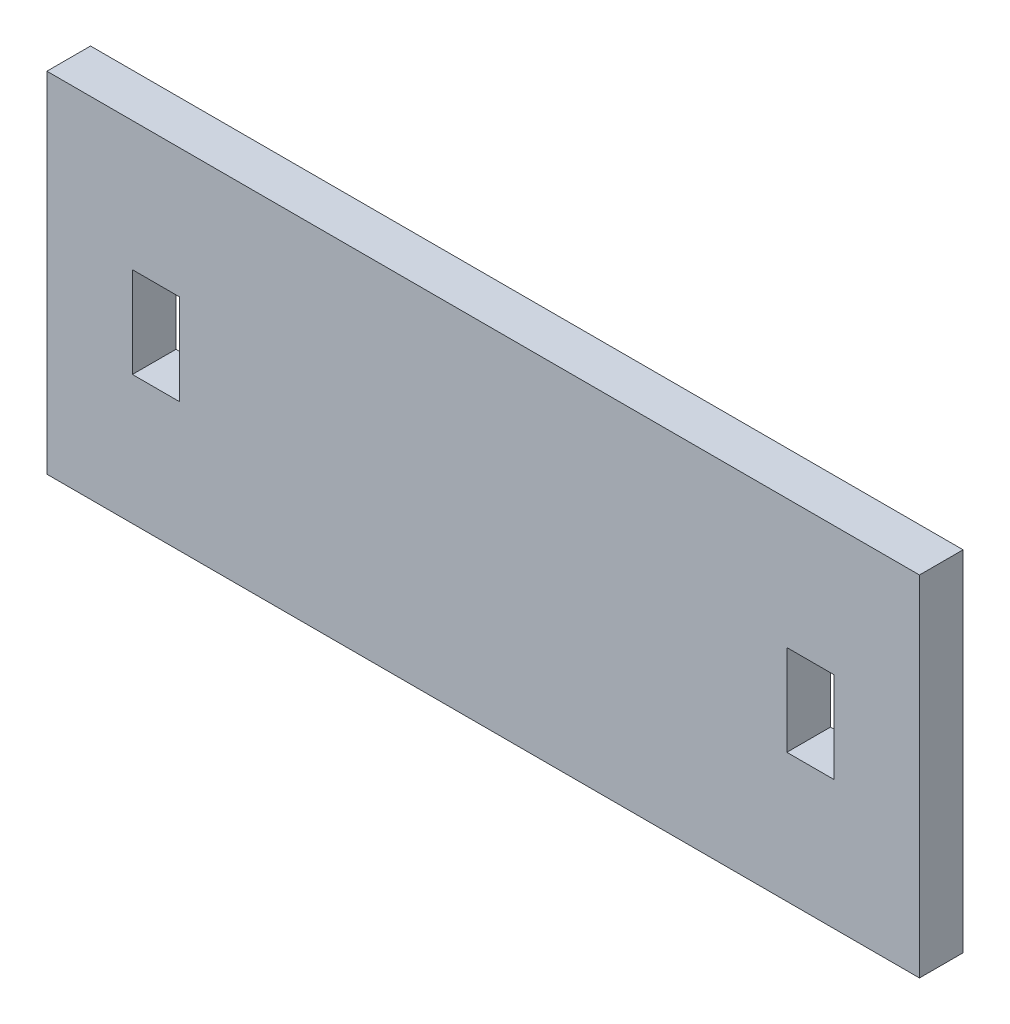
ISO-10303-21;
HEADER;
FILE_DESCRIPTION(('STEP AP214'),'2;1');
FILE_NAME('part.step','',(''),(''),'','','');
FILE_SCHEMA(('AUTOMOTIVE_DESIGN { 1 0 10303 214 1 1 1 1 }'));
ENDSEC;
DATA;
#1=APPLICATION_CONTEXT('core data for automotive mechanical design processes');
#2=APPLICATION_PROTOCOL_DEFINITION('international standard','automotive_design',2000,#1);
#3=PRODUCT_CONTEXT('',#1,'mechanical');
#4=PRODUCT('Part','Part','',(#3));
#5=PRODUCT_RELATED_PRODUCT_CATEGORY('part','',(#4));
#6=PRODUCT_DEFINITION_FORMATION('','',#4);
#7=PRODUCT_DEFINITION_CONTEXT('part definition',#1,'design');
#8=PRODUCT_DEFINITION('design','',#6,#7);
#9=PRODUCT_DEFINITION_SHAPE('','',#8);
#10=(LENGTH_UNIT() NAMED_UNIT(*) SI_UNIT(.MILLI.,.METRE.));
#11=(NAMED_UNIT(*) PLANE_ANGLE_UNIT() SI_UNIT($,.RADIAN.));
#12=(NAMED_UNIT(*) SI_UNIT($,.STERADIAN.) SOLID_ANGLE_UNIT());
#13=UNCERTAINTY_MEASURE_WITH_UNIT(LENGTH_MEASURE(1.E-05),#10,'distance_accuracy_value','');
#14=(GEOMETRIC_REPRESENTATION_CONTEXT(3) GLOBAL_UNCERTAINTY_ASSIGNED_CONTEXT((#13)) GLOBAL_UNIT_ASSIGNED_CONTEXT((#10,
#11,#12)) REPRESENTATION_CONTEXT('',''));
#15=CARTESIAN_POINT('',(0.,0.,0.));
#16=DIRECTION('',(0.,0.,1.));
#17=DIRECTION('',(1.,0.,0.));
#18=AXIS2_PLACEMENT_3D('',#15,#16,#17);
#19=CARTESIAN_POINT('',(-298.,114.,933.));
#20=DIRECTION('',(0.,0.,-1.));
#21=DIRECTION('',(-1.,0.,0.));
#22=AXIS2_PLACEMENT_3D('',#19,#20,#21);
#23=PLANE('',#22);
#24=DIRECTION('',(1.,0.,0.));
#25=VECTOR('',#24,1.);
#26=CARTESIAN_POINT('',(-223.,114.,933.));
#27=LINE('',#26,#25);
#28=CARTESIAN_POINT('',(-308.,114.,933.));
#29=VERTEX_POINT('',#28);
#30=CARTESIAN_POINT('',(-208.,114.,933.));
#31=VERTEX_POINT('',#30);
#32=EDGE_CURVE('E11',#29,#31,#27,.T.);
#33=ORIENTED_EDGE('',*,*,#32,.T.);
#34=DIRECTION('',(0.,1.,0.));
#35=VECTOR('',#34,1.);
#36=CARTESIAN_POINT('',(-208.,74.,933.));
#37=LINE('',#36,#35);
#38=CARTESIAN_POINT('',(-208.,74.,933.));
#39=VERTEX_POINT('',#38);
#40=EDGE_CURVE('E185',#39,#31,#37,.T.);
#41=ORIENTED_EDGE('',*,*,#40,.F.);
#42=DIRECTION('',(1.,0.,0.));
#43=VECTOR('',#42,1.);
#44=CARTESIAN_POINT('',(-223.,74.,933.));
#45=LINE('',#44,#43);
#46=CARTESIAN_POINT('',(-308.,74.,933.));
#47=VERTEX_POINT('',#46);
#48=EDGE_CURVE('E46',#47,#39,#45,.T.);
#49=ORIENTED_EDGE('',*,*,#48,.F.);
#50=DIRECTION('',(0.,1.,0.));
#51=VECTOR('',#50,1.);
#52=CARTESIAN_POINT('',(-308.,74.,933.));
#53=LINE('',#52,#51);
#54=EDGE_CURVE('E189',#47,#29,#53,.T.);
#55=ORIENTED_EDGE('',*,*,#54,.T.);
#56=EDGE_LOOP('',(#33,#41,#49,#55));
#57=FACE_BOUND('',#56,.T.);
#58=DIRECTION('',(1.,0.,0.));
#59=VECTOR('',#58,1.);
#60=CARTESIAN_POINT('',(-298.2,99.2,933.));
#61=LINE('',#60,#59);
#62=CARTESIAN_POINT('',(-298.2,99.2,933.));
#63=VERTEX_POINT('',#62);
#64=CARTESIAN_POINT('',(-292.8,99.2,933.));
#65=VERTEX_POINT('',#64);
#66=EDGE_CURVE('E181',#63,#65,#61,.T.);
#67=ORIENTED_EDGE('',*,*,#66,.F.);
#68=DIRECTION('',(0.,-1.,0.));
#69=VECTOR('',#68,1.);
#70=CARTESIAN_POINT('',(-298.2,99.2,933.));
#71=LINE('',#70,#69);
#72=CARTESIAN_POINT('',(-298.2,88.8,933.));
#73=VERTEX_POINT('',#72);
#74=EDGE_CURVE('E164',#63,#73,#71,.T.);
#75=ORIENTED_EDGE('',*,*,#74,.T.);
#76=DIRECTION('',(1.,0.,0.));
#77=VECTOR('',#76,1.);
#78=CARTESIAN_POINT('',(-298.2,88.8,933.));
#79=LINE('',#78,#77);
#80=CARTESIAN_POINT('',(-292.8,88.8,933.));
#81=VERTEX_POINT('',#80);
#82=EDGE_CURVE('E178',#73,#81,#79,.T.);
#83=ORIENTED_EDGE('',*,*,#82,.T.);
#84=DIRECTION('',(0.,-1.,0.));
#85=VECTOR('',#84,1.);
#86=CARTESIAN_POINT('',(-292.8,99.2,933.));
#87=LINE('',#86,#85);
#88=EDGE_CURVE('E153',#65,#81,#87,.T.);
#89=ORIENTED_EDGE('',*,*,#88,.F.);
#90=EDGE_LOOP('',(#67,#75,#83,#89));
#91=FACE_BOUND('',#90,.T.);
#92=DIRECTION('',(1.,0.,0.));
#93=VECTOR('',#92,1.);
#94=CARTESIAN_POINT('',(-223.2,99.2,933.));
#95=LINE('',#94,#93);
#96=CARTESIAN_POINT('',(-223.2,99.2,933.));
#97=VERTEX_POINT('',#96);
#98=CARTESIAN_POINT('',(-217.8,99.2,933.));
#99=VERTEX_POINT('',#98);
#100=EDGE_CURVE('E144',#97,#99,#95,.T.);
#101=ORIENTED_EDGE('',*,*,#100,.F.);
#102=DIRECTION('',(0.,-1.,0.));
#103=VECTOR('',#102,1.);
#104=CARTESIAN_POINT('',(-223.2,99.2,933.));
#105=LINE('',#104,#103);
#106=CARTESIAN_POINT('',(-223.2,88.8,933.));
#107=VERTEX_POINT('',#106);
#108=EDGE_CURVE('E143',#97,#107,#105,.T.);
#109=ORIENTED_EDGE('',*,*,#108,.T.);
#110=DIRECTION('',(1.,0.,0.));
#111=VECTOR('',#110,1.);
#112=CARTESIAN_POINT('',(-223.2,88.8,933.));
#113=LINE('',#112,#111);
#114=CARTESIAN_POINT('',(-217.8,88.8,933.));
#115=VERTEX_POINT('',#114);
#116=EDGE_CURVE('E129',#107,#115,#113,.T.);
#117=ORIENTED_EDGE('',*,*,#116,.T.);
#118=DIRECTION('',(0.,-1.,0.));
#119=VECTOR('',#118,1.);
#120=CARTESIAN_POINT('',(-217.8,99.2,933.));
#121=LINE('',#120,#119);
#122=EDGE_CURVE('E135',#99,#115,#121,.T.);
#123=ORIENTED_EDGE('',*,*,#122,.F.);
#124=EDGE_LOOP('',(#101,#109,#117,#123));
#125=FACE_BOUND('',#124,.T.);
#126=ADVANCED_FACE('F42',(#57,#91,#125),#23,.T.);
#127=CARTESIAN_POINT('',(-208.,74.,938.));
#128=DIRECTION('',(0.,0.,1.));
#129=DIRECTION('',(1.,0.,0.));
#130=AXIS2_PLACEMENT_3D('',#127,#128,#129);
#131=PLANE('',#130);
#132=DIRECTION('',(1.,0.,0.));
#133=VECTOR('',#132,1.);
#134=CARTESIAN_POINT('',(-208.,114.,938.));
#135=LINE('',#134,#133);
#136=CARTESIAN_POINT('',(-308.,114.,938.));
#137=VERTEX_POINT('',#136);
#138=CARTESIAN_POINT('',(-208.,114.,938.));
#139=VERTEX_POINT('',#138);
#140=EDGE_CURVE('E195',#137,#139,#135,.T.);
#141=ORIENTED_EDGE('',*,*,#140,.F.);
#142=DIRECTION('',(0.,1.,0.));
#143=VECTOR('',#142,1.);
#144=CARTESIAN_POINT('',(-308.,74.,938.));
#145=LINE('',#144,#143);
#146=CARTESIAN_POINT('',(-308.,74.,938.));
#147=VERTEX_POINT('',#146);
#148=EDGE_CURVE('E192',#147,#137,#145,.T.);
#149=ORIENTED_EDGE('',*,*,#148,.F.);
#150=DIRECTION('',(1.,0.,0.));
#151=VECTOR('',#150,1.);
#152=CARTESIAN_POINT('',(-208.,74.,938.));
#153=LINE('',#152,#151);
#154=CARTESIAN_POINT('',(-208.,74.,938.));
#155=VERTEX_POINT('',#154);
#156=EDGE_CURVE('E188',#147,#155,#153,.T.);
#157=ORIENTED_EDGE('',*,*,#156,.T.);
#158=DIRECTION('',(0.,1.,0.));
#159=VECTOR('',#158,1.);
#160=CARTESIAN_POINT('',(-208.,74.,938.));
#161=LINE('',#160,#159);
#162=EDGE_CURVE('E184',#155,#139,#161,.T.);
#163=ORIENTED_EDGE('',*,*,#162,.T.);
#164=EDGE_LOOP('',(#141,#149,#157,#163));
#165=FACE_BOUND('',#164,.T.);
#166=DIRECTION('',(1.,0.,0.));
#167=VECTOR('',#166,1.);
#168=CARTESIAN_POINT('',(-298.2,88.8,938.));
#169=LINE('',#168,#167);
#170=CARTESIAN_POINT('',(-298.2,88.8,938.));
#171=VERTEX_POINT('',#170);
#172=CARTESIAN_POINT('',(-292.8,88.8,938.));
#173=VERTEX_POINT('',#172);
#174=EDGE_CURVE('E175',#171,#173,#169,.T.);
#175=ORIENTED_EDGE('',*,*,#174,.F.);
#176=DIRECTION('',(0.,1.,0.));
#177=VECTOR('',#176,1.);
#178=CARTESIAN_POINT('',(-298.2,99.2,938.));
#179=LINE('',#178,#177);
#180=CARTESIAN_POINT('',(-298.2,99.2,938.));
#181=VERTEX_POINT('',#180);
#182=EDGE_CURVE('E169',#171,#181,#179,.T.);
#183=ORIENTED_EDGE('',*,*,#182,.T.);
#184=DIRECTION('',(1.,0.,0.));
#185=VECTOR('',#184,1.);
#186=CARTESIAN_POINT('',(-298.2,99.2,938.));
#187=LINE('',#186,#185);
#188=CARTESIAN_POINT('',(-292.8,99.2,938.));
#189=VERTEX_POINT('',#188);
#190=EDGE_CURVE('E172',#181,#189,#187,.T.);
#191=ORIENTED_EDGE('',*,*,#190,.T.);
#192=DIRECTION('',(0.,1.,0.));
#193=VECTOR('',#192,1.);
#194=CARTESIAN_POINT('',(-292.8,99.2,938.));
#195=LINE('',#194,#193);
#196=EDGE_CURVE('E158',#173,#189,#195,.T.);
#197=ORIENTED_EDGE('',*,*,#196,.F.);
#198=EDGE_LOOP('',(#175,#183,#191,#197));
#199=FACE_BOUND('',#198,.T.);
#200=DIRECTION('',(1.,0.,0.));
#201=VECTOR('',#200,1.);
#202=CARTESIAN_POINT('',(-223.2,88.8,938.));
#203=LINE('',#202,#201);
#204=CARTESIAN_POINT('',(-223.2,88.8,938.));
#205=VERTEX_POINT('',#204);
#206=CARTESIAN_POINT('',(-217.8,88.8,938.));
#207=VERTEX_POINT('',#206);
#208=EDGE_CURVE('E132',#205,#207,#203,.T.);
#209=ORIENTED_EDGE('',*,*,#208,.F.);
#210=DIRECTION('',(0.,1.,0.));
#211=VECTOR('',#210,1.);
#212=CARTESIAN_POINT('',(-223.2,99.2,938.));
#213=LINE('',#212,#211);
#214=CARTESIAN_POINT('',(-223.2,99.2,938.));
#215=VERTEX_POINT('',#214);
#216=EDGE_CURVE('E358',#205,#215,#213,.T.);
#217=ORIENTED_EDGE('',*,*,#216,.T.);
#218=DIRECTION('',(1.,0.,0.));
#219=VECTOR('',#218,1.);
#220=CARTESIAN_POINT('',(-223.2,99.2,938.));
#221=LINE('',#220,#219);
#222=CARTESIAN_POINT('',(-217.8,99.2,938.));
#223=VERTEX_POINT('',#222);
#224=EDGE_CURVE('E148',#215,#223,#221,.T.);
#225=ORIENTED_EDGE('',*,*,#224,.T.);
#226=DIRECTION('',(0.,1.,0.));
#227=VECTOR('',#226,1.);
#228=CARTESIAN_POINT('',(-217.8,99.2,938.));
#229=LINE('',#228,#227);
#230=EDGE_CURVE('E134',#207,#223,#229,.T.);
#231=ORIENTED_EDGE('',*,*,#230,.F.);
#232=EDGE_LOOP('',(#209,#217,#225,#231));
#233=FACE_BOUND('',#232,.T.);
#234=ADVANCED_FACE('F222',(#165,#199,#233),#131,.T.);
#235=CARTESIAN_POINT('',(-308.,74.,938.));
#236=DIRECTION('',(-1.,0.,0.));
#237=DIRECTION('',(0.,0.,1.));
#238=AXIS2_PLACEMENT_3D('',#235,#236,#237);
#239=PLANE('',#238);
#240=DIRECTION('',(0.,0.,1.));
#241=VECTOR('',#240,1.);
#242=CARTESIAN_POINT('',(-308.,114.,938.));
#243=LINE('',#242,#241);
#244=EDGE_CURVE('E198',#29,#137,#243,.T.);
#245=ORIENTED_EDGE('',*,*,#244,.F.);
#246=ORIENTED_EDGE('',*,*,#54,.F.);
#247=DIRECTION('',(0.,0.,1.));
#248=VECTOR('',#247,1.);
#249=CARTESIAN_POINT('',(-308.,74.,938.));
#250=LINE('',#249,#248);
#251=EDGE_CURVE('E207',#47,#147,#250,.T.);
#252=ORIENTED_EDGE('',*,*,#251,.T.);
#253=ORIENTED_EDGE('',*,*,#148,.T.);
#254=EDGE_LOOP('',(#245,#246,#252,#253));
#255=FACE_BOUND('',#254,.T.);
#256=ADVANCED_FACE('F227',(#255),#239,.T.);
#257=CARTESIAN_POINT('',(-208.,74.,933.));
#258=DIRECTION('',(1.,0.,0.));
#259=DIRECTION('',(0.,0.,-1.));
#260=AXIS2_PLACEMENT_3D('',#257,#258,#259);
#261=PLANE('',#260);
#262=DIRECTION('',(0.,0.,-1.));
#263=VECTOR('',#262,1.);
#264=CARTESIAN_POINT('',(-208.,114.,933.));
#265=LINE('',#264,#263);
#266=EDGE_CURVE('E202',#139,#31,#265,.T.);
#267=ORIENTED_EDGE('',*,*,#266,.F.);
#268=ORIENTED_EDGE('',*,*,#162,.F.);
#269=DIRECTION('',(0.,0.,-1.));
#270=VECTOR('',#269,1.);
#271=CARTESIAN_POINT('',(-208.,74.,933.));
#272=LINE('',#271,#270);
#273=EDGE_CURVE('E199',#155,#39,#272,.T.);
#274=ORIENTED_EDGE('',*,*,#273,.T.);
#275=ORIENTED_EDGE('',*,*,#40,.T.);
#276=EDGE_LOOP('',(#267,#268,#274,#275));
#277=FACE_BOUND('',#276,.T.);
#278=ADVANCED_FACE('F214',(#277),#261,.T.);
#279=CARTESIAN_POINT('',(-550.,74.,0.));
#280=DIRECTION('',(0.,-1.,0.));
#281=DIRECTION('',(0.,0.,-1.));
#282=AXIS2_PLACEMENT_3D('',#279,#280,#281);
#283=PLANE('',#282);
#284=ORIENTED_EDGE('',*,*,#251,.F.);
#285=ORIENTED_EDGE('',*,*,#48,.T.);
#286=ORIENTED_EDGE('',*,*,#273,.F.);
#287=ORIENTED_EDGE('',*,*,#156,.F.);
#288=EDGE_LOOP('',(#284,#285,#286,#287));
#289=FACE_BOUND('',#288,.T.);
#290=ADVANCED_FACE('F219',(#289),#283,.T.);
#291=CARTESIAN_POINT('',(-550.,114.,0.));
#292=DIRECTION('',(0.,-1.,0.));
#293=DIRECTION('',(0.,0.,-1.));
#294=AXIS2_PLACEMENT_3D('',#291,#292,#293);
#295=PLANE('',#294);
#296=ORIENTED_EDGE('',*,*,#32,.F.);
#297=ORIENTED_EDGE('',*,*,#244,.T.);
#298=ORIENTED_EDGE('',*,*,#140,.T.);
#299=ORIENTED_EDGE('',*,*,#266,.T.);
#300=EDGE_LOOP('',(#296,#297,#298,#299));
#301=FACE_BOUND('',#300,.T.);
#302=ADVANCED_FACE('F44',(#301),#295,.F.);
#303=CARTESIAN_POINT('',(-298.2,99.2,933.));
#304=DIRECTION('',(0.,-1.,0.));
#305=DIRECTION('',(0.,0.,-1.));
#306=AXIS2_PLACEMENT_3D('',#303,#304,#305);
#307=PLANE('',#306);
#308=ORIENTED_EDGE('',*,*,#190,.F.);
#309=DIRECTION('',(0.,0.,-1.));
#310=VECTOR('',#309,1.);
#311=CARTESIAN_POINT('',(-298.2,99.2,933.));
#312=LINE('',#311,#310);
#313=EDGE_CURVE('E161',#181,#63,#312,.T.);
#314=ORIENTED_EDGE('',*,*,#313,.T.);
#315=ORIENTED_EDGE('',*,*,#66,.T.);
#316=DIRECTION('',(0.,0.,-1.));
#317=VECTOR('',#316,1.);
#318=CARTESIAN_POINT('',(-292.8,99.2,933.));
#319=LINE('',#318,#317);
#320=EDGE_CURVE('E146',#189,#65,#319,.T.);
#321=ORIENTED_EDGE('',*,*,#320,.F.);
#322=EDGE_LOOP('',(#308,#314,#315,#321));
#323=FACE_BOUND('',#322,.T.);
#324=ADVANCED_FACE('F232',(#323),#307,.T.);
#325=CARTESIAN_POINT('',(-298.2,88.8,933.));
#326=DIRECTION('',(0.,1.,0.));
#327=DIRECTION('',(0.,0.,1.));
#328=AXIS2_PLACEMENT_3D('',#325,#326,#327);
#329=PLANE('',#328);
#330=ORIENTED_EDGE('',*,*,#82,.F.);
#331=DIRECTION('',(0.,0.,1.));
#332=VECTOR('',#331,1.);
#333=CARTESIAN_POINT('',(-298.2,88.8,933.));
#334=LINE('',#333,#332);
#335=EDGE_CURVE('E167',#73,#171,#334,.T.);
#336=ORIENTED_EDGE('',*,*,#335,.T.);
#337=ORIENTED_EDGE('',*,*,#174,.T.);
#338=DIRECTION('',(0.,0.,1.));
#339=VECTOR('',#338,1.);
#340=CARTESIAN_POINT('',(-292.8,88.8,933.));
#341=LINE('',#340,#339);
#342=EDGE_CURVE('E156',#81,#173,#341,.T.);
#343=ORIENTED_EDGE('',*,*,#342,.F.);
#344=EDGE_LOOP('',(#330,#336,#337,#343));
#345=FACE_BOUND('',#344,.T.);
#346=ADVANCED_FACE('F237',(#345),#329,.T.);
#347=CARTESIAN_POINT('',(-298.2,0.,0.));
#348=DIRECTION('',(1.,0.,0.));
#349=DIRECTION('',(0.,0.,-1.));
#350=AXIS2_PLACEMENT_3D('',#347,#348,#349);
#351=PLANE('',#350);
#352=ORIENTED_EDGE('',*,*,#313,.F.);
#353=ORIENTED_EDGE('',*,*,#182,.F.);
#354=ORIENTED_EDGE('',*,*,#335,.F.);
#355=ORIENTED_EDGE('',*,*,#74,.F.);
#356=EDGE_LOOP('',(#352,#353,#354,#355));
#357=FACE_BOUND('',#356,.T.);
#358=ADVANCED_FACE('F253',(#357),#351,.T.);
#359=CARTESIAN_POINT('',(-292.8,0.,0.));
#360=DIRECTION('',(1.,0.,0.));
#361=DIRECTION('',(0.,0.,-1.));
#362=AXIS2_PLACEMENT_3D('',#359,#360,#361);
#363=PLANE('',#362);
#364=ORIENTED_EDGE('',*,*,#320,.T.);
#365=ORIENTED_EDGE('',*,*,#88,.T.);
#366=ORIENTED_EDGE('',*,*,#342,.T.);
#367=ORIENTED_EDGE('',*,*,#196,.T.);
#368=EDGE_LOOP('',(#364,#365,#366,#367));
#369=FACE_BOUND('',#368,.T.);
#370=ADVANCED_FACE('F257',(#369),#363,.F.);
#371=CARTESIAN_POINT('',(-223.2,99.2,933.));
#372=DIRECTION('',(0.,-1.,0.));
#373=DIRECTION('',(0.,0.,-1.));
#374=AXIS2_PLACEMENT_3D('',#371,#372,#373);
#375=PLANE('',#374);
#376=ORIENTED_EDGE('',*,*,#224,.F.);
#377=DIRECTION('',(0.,0.,-1.));
#378=VECTOR('',#377,1.);
#379=CARTESIAN_POINT('',(-223.2,99.2,933.));
#380=LINE('',#379,#378);
#381=EDGE_CURVE('E356',#215,#97,#380,.T.);
#382=ORIENTED_EDGE('',*,*,#381,.T.);
#383=ORIENTED_EDGE('',*,*,#100,.T.);
#384=DIRECTION('',(0.,0.,-1.));
#385=VECTOR('',#384,1.);
#386=CARTESIAN_POINT('',(-217.8,99.2,933.));
#387=LINE('',#386,#385);
#388=EDGE_CURVE('E57',#223,#99,#387,.T.);
#389=ORIENTED_EDGE('',*,*,#388,.F.);
#390=EDGE_LOOP('',(#376,#382,#383,#389));
#391=FACE_BOUND('',#390,.T.);
#392=ADVANCED_FACE('F261',(#391),#375,.T.);
#393=CARTESIAN_POINT('',(-223.2,88.8,933.));
#394=DIRECTION('',(0.,1.,0.));
#395=DIRECTION('',(0.,0.,1.));
#396=AXIS2_PLACEMENT_3D('',#393,#394,#395);
#397=PLANE('',#396);
#398=ORIENTED_EDGE('',*,*,#116,.F.);
#399=DIRECTION('',(0.,0.,1.));
#400=VECTOR('',#399,1.);
#401=CARTESIAN_POINT('',(-223.2,88.8,933.));
#402=LINE('',#401,#400);
#403=EDGE_CURVE('E362',#107,#205,#402,.T.);
#404=ORIENTED_EDGE('',*,*,#403,.T.);
#405=ORIENTED_EDGE('',*,*,#208,.T.);
#406=DIRECTION('',(0.,0.,1.));
#407=VECTOR('',#406,1.);
#408=CARTESIAN_POINT('',(-217.8,88.8,933.));
#409=LINE('',#408,#407);
#410=EDGE_CURVE('E62',#115,#207,#409,.T.);
#411=ORIENTED_EDGE('',*,*,#410,.F.);
#412=EDGE_LOOP('',(#398,#404,#405,#411));
#413=FACE_BOUND('',#412,.T.);
#414=ADVANCED_FACE('F127',(#413),#397,.T.);
#415=CARTESIAN_POINT('',(-223.2,0.,0.));
#416=DIRECTION('',(1.,0.,0.));
#417=DIRECTION('',(0.,0.,-1.));
#418=AXIS2_PLACEMENT_3D('',#415,#416,#417);
#419=PLANE('',#418);
#420=ORIENTED_EDGE('',*,*,#381,.F.);
#421=ORIENTED_EDGE('',*,*,#216,.F.);
#422=ORIENTED_EDGE('',*,*,#403,.F.);
#423=ORIENTED_EDGE('',*,*,#108,.F.);
#424=EDGE_LOOP('',(#420,#421,#422,#423));
#425=FACE_BOUND('',#424,.T.);
#426=ADVANCED_FACE('F268',(#425),#419,.T.);
#427=CARTESIAN_POINT('',(-217.8,0.,0.));
#428=DIRECTION('',(1.,0.,0.));
#429=DIRECTION('',(0.,0.,-1.));
#430=AXIS2_PLACEMENT_3D('',#427,#428,#429);
#431=PLANE('',#430);
#432=ORIENTED_EDGE('',*,*,#388,.T.);
#433=ORIENTED_EDGE('',*,*,#122,.T.);
#434=ORIENTED_EDGE('',*,*,#410,.T.);
#435=ORIENTED_EDGE('',*,*,#230,.T.);
#436=EDGE_LOOP('',(#432,#433,#434,#435));
#437=FACE_BOUND('',#436,.T.);
#438=ADVANCED_FACE('F138',(#437),#431,.F.);
#439=CLOSED_SHELL('',(#126,#234,#256,#278,#290,#302,#324,#346,#358,#370,#392,#414,#426,#438));
#440=MANIFOLD_SOLID_BREP('B2',#439);
#441=ADVANCED_BREP_SHAPE_REPRESENTATION('',(#18,#440),#14);
#442=SHAPE_DEFINITION_REPRESENTATION(#9,#441);
ENDSEC;
END-ISO-10303-21;
